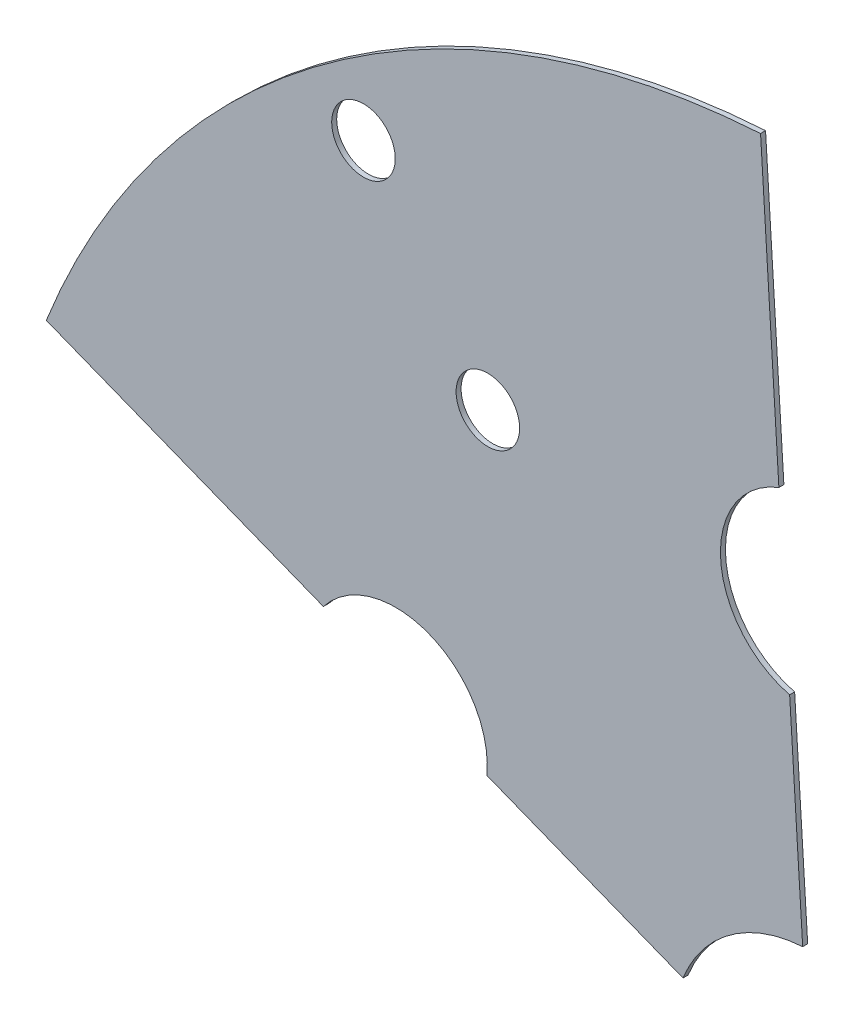
ISO-10303-21;
HEADER;
FILE_DESCRIPTION(('STEP AP214'),'2;1');
FILE_NAME('part.step','',(''),(''),'','','');
FILE_SCHEMA(('AUTOMOTIVE_DESIGN { 1 0 10303 214 1 1 1 1 }'));
ENDSEC;
DATA;
#1=APPLICATION_CONTEXT('core data for automotive mechanical design processes');
#2=APPLICATION_PROTOCOL_DEFINITION('international standard','automotive_design',2000,#1);
#3=PRODUCT_CONTEXT('',#1,'mechanical');
#4=PRODUCT('Part','Part','',(#3));
#5=PRODUCT_RELATED_PRODUCT_CATEGORY('part','',(#4));
#6=PRODUCT_DEFINITION_FORMATION('','',#4);
#7=PRODUCT_DEFINITION_CONTEXT('part definition',#1,'design');
#8=PRODUCT_DEFINITION('design','',#6,#7);
#9=PRODUCT_DEFINITION_SHAPE('','',#8);
#10=(LENGTH_UNIT() NAMED_UNIT(*) SI_UNIT(.MILLI.,.METRE.));
#11=(NAMED_UNIT(*) PLANE_ANGLE_UNIT() SI_UNIT($,.RADIAN.));
#12=(NAMED_UNIT(*) SI_UNIT($,.STERADIAN.) SOLID_ANGLE_UNIT());
#13=UNCERTAINTY_MEASURE_WITH_UNIT(LENGTH_MEASURE(1.E-05),#10,'distance_accuracy_value','');
#14=(GEOMETRIC_REPRESENTATION_CONTEXT(3) GLOBAL_UNCERTAINTY_ASSIGNED_CONTEXT((#13)) GLOBAL_UNIT_ASSIGNED_CONTEXT((#10,
#11,#12)) REPRESENTATION_CONTEXT('',''));
#15=CARTESIAN_POINT('',(0.,0.,0.));
#16=DIRECTION('',(0.,0.,1.));
#17=DIRECTION('',(1.,0.,0.));
#18=AXIS2_PLACEMENT_3D('',#15,#16,#17);
#19=CARTESIAN_POINT('',(-7.67906470511972,3.02935475878685,0.3));
#20=DIRECTION('',(0.366972108877873,0.930231944896393,0.));
#21=DIRECTION('',(-0.930231944896393,0.366972108877873,0.));
#22=AXIS2_PLACEMENT_3D('',#19,#20,#21);
#23=PLANE('',#22);
#24=DIRECTION('',(0.930231944896393,-0.366972108877873,0.));
#25=VECTOR('',#24,1.);
#26=CARTESIAN_POINT('',(-30.6620344856289,12.0960277911447,0.3));
#27=LINE('',#26,#25);
#28=CARTESIAN_POINT('',(-19.4323141154316,7.66595614184314,0.3));
#29=VERTEX_POINT('',#28);
#30=CARTESIAN_POINT('',(-7.67906470511972,3.02935475878685,0.3));
#31=VERTEX_POINT('',#30);
#32=EDGE_CURVE('E126',#29,#31,#27,.T.);
#33=ORIENTED_EDGE('',*,*,#32,.F.);
#34=DIRECTION('',(0.,0.,-1.));
#35=VECTOR('',#34,1.);
#36=CARTESIAN_POINT('',(-19.4323141154316,7.66595614184314,0.3));
#37=LINE('',#36,#35);
#38=CARTESIAN_POINT('',(-19.4323141154316,7.66595614184314,0.));
#39=VERTEX_POINT('',#38);
#40=EDGE_CURVE('E163',#29,#39,#37,.T.);
#41=ORIENTED_EDGE('',*,*,#40,.T.);
#42=DIRECTION('',(0.930231944896393,-0.366972108877873,0.));
#43=VECTOR('',#42,1.);
#44=CARTESIAN_POINT('',(-7.67906470511972,3.02935475878685,0.));
#45=LINE('',#44,#43);
#46=CARTESIAN_POINT('',(-7.67906470511972,3.02935475878685,0.));
#47=VERTEX_POINT('',#46);
#48=EDGE_CURVE('E136',#39,#47,#45,.T.);
#49=ORIENTED_EDGE('',*,*,#48,.T.);
#50=DIRECTION('',(0.,0.,-1.));
#51=VECTOR('',#50,1.);
#52=CARTESIAN_POINT('',(-7.67906470511972,3.02935475878685,0.3));
#53=LINE('',#52,#51);
#54=EDGE_CURVE('E145',#31,#47,#53,.T.);
#55=ORIENTED_EDGE('',*,*,#54,.F.);
#56=EDGE_LOOP('',(#33,#41,#49,#55));
#57=FACE_BOUND('',#56,.T.);
#58=ADVANCED_FACE('F32',(#57),#23,.F.);
#59=CARTESIAN_POINT('',(-0.508126088727103,8.23934662931199,0.3));
#60=DIRECTION('',(-0.998103770964506,-0.0615537357634287,0.));
#61=DIRECTION('',(0.0615537357634287,-0.998103770964506,0.));
#62=AXIS2_PLACEMENT_3D('',#59,#60,#61);
#63=PLANE('',#62);
#64=DIRECTION('',(-0.0615537357634286,0.998103770964505,0.));
#65=VECTOR('',#64,1.);
#66=CARTESIAN_POINT('',(-2.02891631388529,32.8992058523195,0.3));
#67=LINE('',#66,#65);
#68=CARTESIAN_POINT('',(-1.93399156339175,31.3599856855759,0.3));
#69=VERTEX_POINT('',#68);
#70=CARTESIAN_POINT('',(-3.03312188347871,49.182561418047,0.3));
#71=VERTEX_POINT('',#70);
#72=EDGE_CURVE('E108',#69,#71,#67,.T.);
#73=ORIENTED_EDGE('',*,*,#72,.F.);
#74=DIRECTION('',(0.,0.,-1.));
#75=VECTOR('',#74,1.);
#76=CARTESIAN_POINT('',(-1.93399156339175,31.3599856855759,0.3));
#77=LINE('',#76,#75);
#78=CARTESIAN_POINT('',(-1.93399156339175,31.3599856855759,0.));
#79=VERTEX_POINT('',#78);
#80=EDGE_CURVE('E95',#69,#79,#77,.T.);
#81=ORIENTED_EDGE('',*,*,#80,.T.);
#82=DIRECTION('',(-0.0615537357634287,0.998103770964506,0.));
#83=VECTOR('',#82,1.);
#84=CARTESIAN_POINT('',(-0.508126088727103,8.23934662931199,0.));
#85=LINE('',#84,#83);
#86=CARTESIAN_POINT('',(-3.03312188347871,49.182561418047,0.));
#87=VERTEX_POINT('',#86);
#88=EDGE_CURVE('E119',#79,#87,#85,.T.);
#89=ORIENTED_EDGE('',*,*,#88,.T.);
#90=DIRECTION('',(0.,0.,-1.));
#91=VECTOR('',#90,1.);
#92=CARTESIAN_POINT('',(-3.03312188347871,49.182561418047,0.3));
#93=LINE('',#92,#91);
#94=EDGE_CURVE('E11',#71,#87,#93,.T.);
#95=ORIENTED_EDGE('',*,*,#94,.F.);
#96=EDGE_LOOP('',(#73,#81,#89,#95));
#97=FACE_BOUND('',#96,.T.);
#98=ADVANCED_FACE('F113',(#97),#63,.F.);
#99=CARTESIAN_POINT('',(0.,0.,0.3));
#100=DIRECTION('',(0.,0.,-1.));
#101=DIRECTION('',(-1.,0.,0.));
#102=AXIS2_PLACEMENT_3D('',#99,#100,#101);
#103=CYLINDRICAL_SURFACE('',#102,49.276);
#104=CARTESIAN_POINT('',(0.,0.,0.));
#105=DIRECTION('',(0.,0.,1.));
#106=DIRECTION('',(1.,0.,0.));
#107=AXIS2_PLACEMENT_3D('',#104,#105,#106);
#108=CIRCLE('',#107,49.276);
#109=CARTESIAN_POINT('',(-45.8381093167147,18.0829176370661,0.));
#110=VERTEX_POINT('',#109);
#111=EDGE_CURVE('E133',#87,#110,#108,.T.);
#112=ORIENTED_EDGE('',*,*,#111,.T.);
#113=DIRECTION('',(0.,0.,-1.));
#114=VECTOR('',#113,1.);
#115=CARTESIAN_POINT('',(-45.8381093167147,18.0829176370661,0.3));
#116=LINE('',#115,#114);
#117=CARTESIAN_POINT('',(-45.8381093167147,18.0829176370661,0.3));
#118=VERTEX_POINT('',#117);
#119=EDGE_CURVE('E40',#118,#110,#116,.T.);
#120=ORIENTED_EDGE('',*,*,#119,.F.);
#121=CARTESIAN_POINT('',(0.,0.,0.3));
#122=DIRECTION('',(0.,0.,1.));
#123=DIRECTION('',(1.,0.,0.));
#124=AXIS2_PLACEMENT_3D('',#121,#122,#123);
#125=CIRCLE('',#124,49.276);
#126=EDGE_CURVE('E117',#71,#118,#125,.T.);
#127=ORIENTED_EDGE('',*,*,#126,.F.);
#128=ORIENTED_EDGE('',*,*,#94,.T.);
#129=EDGE_LOOP('',(#112,#120,#127,#128));
#130=FACE_BOUND('',#129,.T.);
#131=ADVANCED_FACE('F34',(#130),#103,.T.);
#132=CARTESIAN_POINT('',(-29.2331048349348,11.5323217926243,0.));
#133=VERTEX_POINT('',#132);
#134=EDGE_CURVE('E138',#110,#133,#45,.T.);
#135=ORIENTED_EDGE('',*,*,#134,.T.);
#136=DIRECTION('',(0.,0.,-1.));
#137=VECTOR('',#136,1.);
#138=CARTESIAN_POINT('',(-29.2331048349348,11.5323217926243,0.3));
#139=LINE('',#138,#137);
#140=CARTESIAN_POINT('',(-29.2331048349348,11.5323217926243,0.3));
#141=VERTEX_POINT('',#140);
#142=EDGE_CURVE('E47',#141,#133,#139,.T.);
#143=ORIENTED_EDGE('',*,*,#142,.F.);
#144=EDGE_CURVE('E127',#118,#141,#27,.T.);
#145=ORIENTED_EDGE('',*,*,#144,.F.);
#146=ORIENTED_EDGE('',*,*,#119,.T.);
#147=EDGE_LOOP('',(#135,#143,#145,#146));
#148=FACE_BOUND('',#147,.T.);
#149=ADVANCED_FACE('F151',(#148),#23,.F.);
#150=CARTESIAN_POINT('',(0.,0.,0.3));
#151=DIRECTION('',(0.,0.,-1.));
#152=DIRECTION('',(-1.,0.,0.));
#153=AXIS2_PLACEMENT_3D('',#150,#151,#152);
#154=CYLINDRICAL_SURFACE('',#153,8.255);
#155=CARTESIAN_POINT('',(0.,0.,0.));
#156=DIRECTION('',(0.,0.,-1.));
#157=DIRECTION('',(1.,0.,0.));
#158=AXIS2_PLACEMENT_3D('',#155,#156,#157);
#159=CIRCLE('',#158,8.255);
#160=CARTESIAN_POINT('',(-0.508126088727103,8.23934662931199,0.));
#161=VERTEX_POINT('',#160);
#162=EDGE_CURVE('E141',#47,#161,#159,.T.);
#163=ORIENTED_EDGE('',*,*,#162,.T.);
#164=DIRECTION('',(0.,0.,-1.));
#165=VECTOR('',#164,1.);
#166=CARTESIAN_POINT('',(-0.508126088727103,8.23934662931199,0.3));
#167=LINE('',#166,#165);
#168=CARTESIAN_POINT('',(-0.508126088727103,8.23934662931199,0.3));
#169=VERTEX_POINT('',#168);
#170=EDGE_CURVE('E132',#169,#161,#167,.T.);
#171=ORIENTED_EDGE('',*,*,#170,.F.);
#172=CARTESIAN_POINT('',(0.,0.,0.3));
#173=DIRECTION('',(0.,0.,-1.));
#174=DIRECTION('',(1.,0.,0.));
#175=AXIS2_PLACEMENT_3D('',#172,#173,#174);
#176=CIRCLE('',#175,8.255);
#177=EDGE_CURVE('E130',#31,#169,#176,.T.);
#178=ORIENTED_EDGE('',*,*,#177,.F.);
#179=ORIENTED_EDGE('',*,*,#54,.T.);
#180=EDGE_LOOP('',(#163,#171,#178,#179));
#181=FACE_BOUND('',#180,.T.);
#182=ADVANCED_FACE('F205',(#181),#154,.F.);
#183=CARTESIAN_POINT('',(-1.29033277756548,20.9229544740709,0.));
#184=VERTEX_POINT('',#183);
#185=EDGE_CURVE('E115',#161,#184,#85,.T.);
#186=ORIENTED_EDGE('',*,*,#185,.T.);
#187=DIRECTION('',(0.,0.,-1.));
#188=VECTOR('',#187,1.);
#189=CARTESIAN_POINT('',(-1.29033277756547,20.9229544740709,0.3));
#190=LINE('',#189,#188);
#191=CARTESIAN_POINT('',(-1.29033277756547,20.9229544740709,0.3));
#192=VERTEX_POINT('',#191);
#193=EDGE_CURVE('E55',#192,#184,#190,.T.);
#194=ORIENTED_EDGE('',*,*,#193,.F.);
#195=EDGE_CURVE('E111',#169,#192,#67,.T.);
#196=ORIENTED_EDGE('',*,*,#195,.F.);
#197=ORIENTED_EDGE('',*,*,#170,.T.);
#198=EDGE_LOOP('',(#186,#194,#196,#197));
#199=FACE_BOUND('',#198,.T.);
#200=ADVANCED_FACE('F193',(#199),#63,.F.);
#201=CARTESIAN_POINT('',(0.,0.,0.3));
#202=DIRECTION('',(0.,0.,1.));
#203=DIRECTION('',(1.,0.,0.));
#204=AXIS2_PLACEMENT_3D('',#201,#202,#203);
#205=PLANE('',#204);
#206=CARTESIAN_POINT('',(0.0486337008426607,26.2438924863849,0.3));
#207=DIRECTION('',(0.,0.,-1.));
#208=DIRECTION('',(-1.,0.,0.));
#209=AXIS2_PLACEMENT_3D('',#206,#207,#208);
#210=CIRCLE('',#209,5.4868217176421);
#211=EDGE_CURVE('E98',#192,#69,#210,.T.);
#212=ORIENTED_EDGE('',*,*,#211,.T.);
#213=ORIENTED_EDGE('',*,*,#72,.T.);
#214=ORIENTED_EDGE('',*,*,#126,.T.);
#215=ORIENTED_EDGE('',*,*,#144,.T.);
#216=CARTESIAN_POINT('',(-24.895762621217,8.17186422224929,0.3));
#217=DIRECTION('',(0.,0.,-1.));
#218=DIRECTION('',(-1.,0.,0.));
#219=AXIS2_PLACEMENT_3D('',#216,#217,#218);
#220=CIRCLE('',#219,5.4868217176421);
#221=EDGE_CURVE('E160',#141,#29,#220,.T.);
#222=ORIENTED_EDGE('',*,*,#221,.T.);
#223=ORIENTED_EDGE('',*,*,#32,.T.);
#224=ORIENTED_EDGE('',*,*,#177,.T.);
#225=ORIENTED_EDGE('',*,*,#195,.T.);
#226=EDGE_LOOP('',(#212,#213,#214,#215,#222,#223,#224,#225));
#227=FACE_BOUND('',#226,.T.);
#228=CARTESIAN_POINT('',(-26.8310762848942,36.9249217922198,0.3));
#229=DIRECTION('',(0.,0.,-1.));
#230=DIRECTION('',(-1.,0.,0.));
#231=AXIS2_PLACEMENT_3D('',#228,#229,#230);
#232=CIRCLE('',#231,1.905);
#233=CARTESIAN_POINT('',(-28.7360762848942,36.9249217922198,0.3));
#234=VERTEX_POINT('',#233);
#235=EDGE_CURVE('E137',#234,#234,#232,.T.);
#236=ORIENTED_EDGE('',*,*,#235,.T.);
#237=EDGE_LOOP('',(#236));
#238=FACE_BOUND('',#237,.T.);
#239=CARTESIAN_POINT('',(-19.3758104015947,26.6636286181418,0.3));
#240=DIRECTION('',(0.,0.,-1.));
#241=DIRECTION('',(-1.,0.,0.));
#242=AXIS2_PLACEMENT_3D('',#239,#240,#241);
#243=CIRCLE('',#242,1.905);
#244=CARTESIAN_POINT('',(-21.2808104015947,26.6636286181418,0.3));
#245=VERTEX_POINT('',#244);
#246=EDGE_CURVE('E172',#245,#245,#243,.T.);
#247=ORIENTED_EDGE('',*,*,#246,.T.);
#248=EDGE_LOOP('',(#247));
#249=FACE_BOUND('',#248,.T.);
#250=ADVANCED_FACE('F106',(#227,#238,#249),#205,.T.);
#251=CARTESIAN_POINT('',(0.,0.,0.));
#252=DIRECTION('',(0.,0.,1.));
#253=DIRECTION('',(1.,0.,0.));
#254=AXIS2_PLACEMENT_3D('',#251,#252,#253);
#255=PLANE('',#254);
#256=CARTESIAN_POINT('',(-26.8310762848942,36.9249217922198,0.));
#257=DIRECTION('',(0.,0.,-1.));
#258=DIRECTION('',(-1.,0.,0.));
#259=AXIS2_PLACEMENT_3D('',#256,#257,#258);
#260=CIRCLE('',#259,1.905);
#261=CARTESIAN_POINT('',(-28.7360762848942,36.9249217922198,0.));
#262=VERTEX_POINT('',#261);
#263=EDGE_CURVE('E170',#262,#262,#260,.T.);
#264=ORIENTED_EDGE('',*,*,#263,.F.);
#265=EDGE_LOOP('',(#264));
#266=FACE_BOUND('',#265,.T.);
#267=CARTESIAN_POINT('',(-19.3758104015947,26.6636286181418,0.));
#268=DIRECTION('',(0.,0.,-1.));
#269=DIRECTION('',(-1.,0.,0.));
#270=AXIS2_PLACEMENT_3D('',#267,#268,#269);
#271=CIRCLE('',#270,1.905);
#272=CARTESIAN_POINT('',(-21.2808104015947,26.6636286181418,0.));
#273=VERTEX_POINT('',#272);
#274=EDGE_CURVE('E123',#273,#273,#271,.T.);
#275=ORIENTED_EDGE('',*,*,#274,.F.);
#276=EDGE_LOOP('',(#275));
#277=FACE_BOUND('',#276,.T.);
#278=ORIENTED_EDGE('',*,*,#88,.F.);
#279=CARTESIAN_POINT('',(0.0486337008426607,26.2438924863849,0.));
#280=DIRECTION('',(0.,0.,-1.));
#281=DIRECTION('',(-1.,0.,0.));
#282=AXIS2_PLACEMENT_3D('',#279,#280,#281);
#283=CIRCLE('',#282,5.4868217176421);
#284=EDGE_CURVE('E99',#184,#79,#283,.T.);
#285=ORIENTED_EDGE('',*,*,#284,.F.);
#286=ORIENTED_EDGE('',*,*,#185,.F.);
#287=ORIENTED_EDGE('',*,*,#162,.F.);
#288=ORIENTED_EDGE('',*,*,#48,.F.);
#289=CARTESIAN_POINT('',(-24.895762621217,8.17186422224929,0.));
#290=DIRECTION('',(0.,0.,-1.));
#291=DIRECTION('',(-1.,0.,0.));
#292=AXIS2_PLACEMENT_3D('',#289,#290,#291);
#293=CIRCLE('',#292,5.4868217176421);
#294=EDGE_CURVE('E157',#133,#39,#293,.T.);
#295=ORIENTED_EDGE('',*,*,#294,.F.);
#296=ORIENTED_EDGE('',*,*,#134,.F.);
#297=ORIENTED_EDGE('',*,*,#111,.F.);
#298=EDGE_LOOP('',(#278,#285,#286,#287,#288,#295,#296,#297));
#299=FACE_BOUND('',#298,.T.);
#300=ADVANCED_FACE('F155',(#266,#277,#299),#255,.F.);
#301=CARTESIAN_POINT('',(-19.3758104015947,26.6636286181418,0.3));
#302=DIRECTION('',(0.,0.,-1.));
#303=DIRECTION('',(-1.,0.,0.));
#304=AXIS2_PLACEMENT_3D('',#301,#302,#303);
#305=CYLINDRICAL_SURFACE('',#304,1.905);
#306=ORIENTED_EDGE('',*,*,#246,.F.);
#307=EDGE_LOOP('',(#306));
#308=FACE_BOUND('',#307,.T.);
#309=ORIENTED_EDGE('',*,*,#274,.T.);
#310=EDGE_LOOP('',(#309));
#311=FACE_BOUND('',#310,.T.);
#312=ADVANCED_FACE('F181',(#308,#311),#305,.F.);
#313=CARTESIAN_POINT('',(-26.8310762848942,36.9249217922198,0.3));
#314=DIRECTION('',(0.,0.,-1.));
#315=DIRECTION('',(-1.,0.,0.));
#316=AXIS2_PLACEMENT_3D('',#313,#314,#315);
#317=CYLINDRICAL_SURFACE('',#316,1.905);
#318=ORIENTED_EDGE('',*,*,#235,.F.);
#319=EDGE_LOOP('',(#318));
#320=FACE_BOUND('',#319,.T.);
#321=ORIENTED_EDGE('',*,*,#263,.T.);
#322=EDGE_LOOP('',(#321));
#323=FACE_BOUND('',#322,.T.);
#324=ADVANCED_FACE('F190',(#320,#323),#317,.F.);
#325=CARTESIAN_POINT('',(-24.895762621217,8.17186422224929,0.3));
#326=DIRECTION('',(0.,0.,-1.));
#327=DIRECTION('',(-1.,0.,0.));
#328=AXIS2_PLACEMENT_3D('',#325,#326,#327);
#329=CYLINDRICAL_SURFACE('',#328,5.4868217176421);
#330=ORIENTED_EDGE('',*,*,#294,.T.);
#331=ORIENTED_EDGE('',*,*,#40,.F.);
#332=ORIENTED_EDGE('',*,*,#221,.F.);
#333=ORIENTED_EDGE('',*,*,#142,.T.);
#334=EDGE_LOOP('',(#330,#331,#332,#333));
#335=FACE_BOUND('',#334,.T.);
#336=ADVANCED_FACE('F254',(#335),#329,.F.);
#337=CARTESIAN_POINT('',(0.0486337008426607,26.2438924863849,0.3));
#338=DIRECTION('',(0.,0.,-1.));
#339=DIRECTION('',(-1.,0.,0.));
#340=AXIS2_PLACEMENT_3D('',#337,#338,#339);
#341=CYLINDRICAL_SURFACE('',#340,5.4868217176421);
#342=ORIENTED_EDGE('',*,*,#284,.T.);
#343=ORIENTED_EDGE('',*,*,#80,.F.);
#344=ORIENTED_EDGE('',*,*,#211,.F.);
#345=ORIENTED_EDGE('',*,*,#193,.T.);
#346=EDGE_LOOP('',(#342,#343,#344,#345));
#347=FACE_BOUND('',#346,.T.);
#348=ADVANCED_FACE('F97',(#347),#341,.F.);
#349=CLOSED_SHELL('',(#58,#98,#131,#149,#182,#200,#250,#300,#312,#324,#336,#348));
#350=MANIFOLD_SOLID_BREP('B2',#349);
#351=ADVANCED_BREP_SHAPE_REPRESENTATION('',(#18,#350),#14);
#352=SHAPE_DEFINITION_REPRESENTATION(#9,#351);
ENDSEC;
END-ISO-10303-21;
